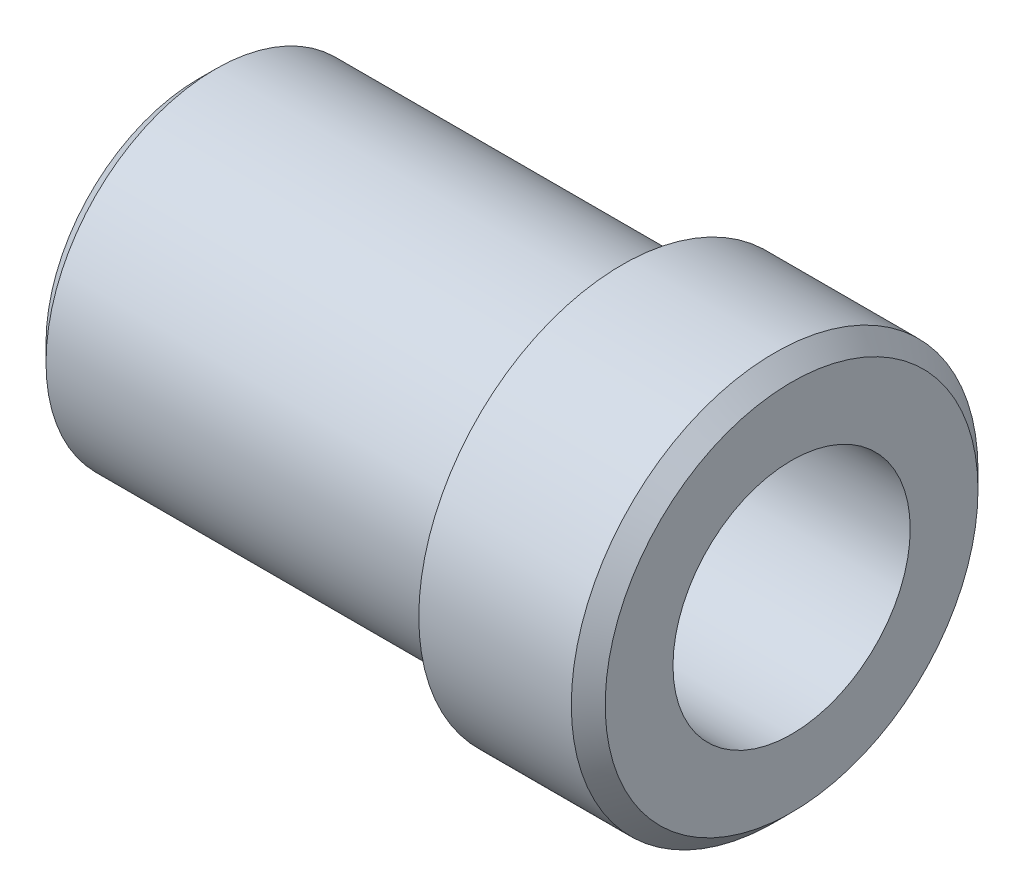
ISO-10303-21;
HEADER;
FILE_DESCRIPTION(('STEP AP214'),'2;1');
FILE_NAME('part.step','',(''),(''),'','','');
FILE_SCHEMA(('AUTOMOTIVE_DESIGN { 1 0 10303 214 1 1 1 1 }'));
ENDSEC;
DATA;
#1=APPLICATION_CONTEXT('core data for automotive mechanical design processes');
#2=APPLICATION_PROTOCOL_DEFINITION('international standard','automotive_design',2000,#1);
#3=PRODUCT_CONTEXT('',#1,'mechanical');
#4=PRODUCT('Part','Part','',(#3));
#5=PRODUCT_RELATED_PRODUCT_CATEGORY('part','',(#4));
#6=PRODUCT_DEFINITION_FORMATION('','',#4);
#7=PRODUCT_DEFINITION_CONTEXT('part definition',#1,'design');
#8=PRODUCT_DEFINITION('design','',#6,#7);
#9=PRODUCT_DEFINITION_SHAPE('','',#8);
#10=(LENGTH_UNIT() NAMED_UNIT(*) SI_UNIT(.MILLI.,.METRE.));
#11=(NAMED_UNIT(*) PLANE_ANGLE_UNIT() SI_UNIT($,.RADIAN.));
#12=(NAMED_UNIT(*) SI_UNIT($,.STERADIAN.) SOLID_ANGLE_UNIT());
#13=UNCERTAINTY_MEASURE_WITH_UNIT(LENGTH_MEASURE(1.E-05),#10,'distance_accuracy_value','');
#14=(GEOMETRIC_REPRESENTATION_CONTEXT(3) GLOBAL_UNCERTAINTY_ASSIGNED_CONTEXT((#13)) GLOBAL_UNIT_ASSIGNED_CONTEXT((#10,
#11,#12)) REPRESENTATION_CONTEXT('',''));
#15=CARTESIAN_POINT('',(0.,0.,0.));
#16=DIRECTION('',(0.,0.,1.));
#17=DIRECTION('',(1.,0.,0.));
#18=AXIS2_PLACEMENT_3D('',#15,#16,#17);
#19=CARTESIAN_POINT('',(0.,0.,0.));
#20=DIRECTION('',(1.,0.,0.));
#21=DIRECTION('',(0.,0.,-1.));
#22=AXIS2_PLACEMENT_3D('',#19,#20,#21);
#23=CYLINDRICAL_SURFACE('',#22,7.);
#24=CARTESIAN_POINT('',(0.,0.,0.));
#25=DIRECTION('',(1.,0.,0.));
#26=DIRECTION('',(0.,0.,-1.));
#27=AXIS2_PLACEMENT_3D('',#24,#25,#26);
#28=CIRCLE('',#27,7.);
#29=CARTESIAN_POINT('',(0.,0.,-7.));
#30=VERTEX_POINT('',#29);
#31=EDGE_CURVE('E64',#30,#30,#28,.T.);
#32=ORIENTED_EDGE('',*,*,#31,.T.);
#33=EDGE_LOOP('',(#32));
#34=FACE_BOUND('',#33,.T.);
#35=CARTESIAN_POINT('',(-35.,0.,0.));
#36=DIRECTION('',(1.,0.,0.));
#37=DIRECTION('',(0.,0.,-1.));
#38=AXIS2_PLACEMENT_3D('',#35,#36,#37);
#39=CIRCLE('',#38,7.);
#40=CARTESIAN_POINT('',(-35.,0.,-7.));
#41=VERTEX_POINT('',#40);
#42=EDGE_CURVE('E76',#41,#41,#39,.T.);
#43=ORIENTED_EDGE('',*,*,#42,.F.);
#44=EDGE_LOOP('',(#43));
#45=FACE_BOUND('',#44,.T.);
#46=ADVANCED_FACE('F39',(#34,#45),#23,.F.);
#47=CARTESIAN_POINT('',(0.,7.,0.));
#48=DIRECTION('',(1.,0.,0.));
#49=DIRECTION('',(0.,0.,-1.));
#50=AXIS2_PLACEMENT_3D('',#47,#48,#49);
#51=PLANE('',#50);
#52=CARTESIAN_POINT('',(0.,0.,0.));
#53=DIRECTION('',(1.,0.,0.));
#54=DIRECTION('',(0.,0.,-1.));
#55=AXIS2_PLACEMENT_3D('',#52,#53,#54);
#56=CIRCLE('',#55,11.);
#57=CARTESIAN_POINT('',(0.,0.,-11.));
#58=VERTEX_POINT('',#57);
#59=EDGE_CURVE('E58',#58,#58,#56,.T.);
#60=ORIENTED_EDGE('',*,*,#59,.T.);
#61=EDGE_LOOP('',(#60));
#62=FACE_BOUND('',#61,.T.);
#63=ORIENTED_EDGE('',*,*,#31,.F.);
#64=EDGE_LOOP('',(#63));
#65=FACE_BOUND('',#64,.T.);
#66=ADVANCED_FACE('F84',(#62,#65),#51,.T.);
#67=CARTESIAN_POINT('',(0.,0.,0.));
#68=DIRECTION('',(1.,0.,0.));
#69=DIRECTION('',(0.,0.,-1.));
#70=AXIS2_PLACEMENT_3D('',#67,#68,#69);
#71=CYLINDRICAL_SURFACE('',#70,12.);
#72=CARTESIAN_POINT('',(-0.999999999999999,0.,0.));
#73=DIRECTION('',(1.,0.,0.));
#74=DIRECTION('',(0.,0.,-1.));
#75=AXIS2_PLACEMENT_3D('',#72,#73,#74);
#76=CIRCLE('',#75,12.);
#77=CARTESIAN_POINT('',(-0.999999999999999,0.,-12.));
#78=VERTEX_POINT('',#77);
#79=EDGE_CURVE('E53',#78,#78,#76,.F.);
#80=ORIENTED_EDGE('',*,*,#79,.T.);
#81=EDGE_LOOP('',(#80));
#82=FACE_BOUND('',#81,.T.);
#83=CARTESIAN_POINT('',(-10.,0.,0.));
#84=DIRECTION('',(1.,0.,0.));
#85=DIRECTION('',(0.,0.,-1.));
#86=AXIS2_PLACEMENT_3D('',#83,#84,#85);
#87=CIRCLE('',#86,12.);
#88=CARTESIAN_POINT('',(-10.,0.,-12.));
#89=VERTEX_POINT('',#88);
#90=EDGE_CURVE('E68',#89,#89,#87,.T.);
#91=ORIENTED_EDGE('',*,*,#90,.T.);
#92=EDGE_LOOP('',(#91));
#93=FACE_BOUND('',#92,.T.);
#94=ADVANCED_FACE('F90',(#82,#93),#71,.T.);
#95=CARTESIAN_POINT('',(-10.,12.,0.));
#96=DIRECTION('',(-1.,0.,0.));
#97=DIRECTION('',(0.,0.,1.));
#98=AXIS2_PLACEMENT_3D('',#95,#96,#97);
#99=PLANE('',#98);
#100=CARTESIAN_POINT('',(-10.,0.,0.));
#101=DIRECTION('',(1.,0.,0.));
#102=DIRECTION('',(0.,0.,-1.));
#103=AXIS2_PLACEMENT_3D('',#100,#101,#102);
#104=CIRCLE('',#103,10.);
#105=CARTESIAN_POINT('',(-10.,0.,-10.));
#106=VERTEX_POINT('',#105);
#107=EDGE_CURVE('E72',#106,#106,#104,.T.);
#108=ORIENTED_EDGE('',*,*,#107,.T.);
#109=EDGE_LOOP('',(#108));
#110=FACE_BOUND('',#109,.T.);
#111=ORIENTED_EDGE('',*,*,#90,.F.);
#112=EDGE_LOOP('',(#111));
#113=FACE_BOUND('',#112,.T.);
#114=ADVANCED_FACE('F115',(#110,#113),#99,.T.);
#115=CARTESIAN_POINT('',(0.,0.,0.));
#116=DIRECTION('',(1.,0.,0.));
#117=DIRECTION('',(0.,0.,-1.));
#118=AXIS2_PLACEMENT_3D('',#115,#116,#117);
#119=CYLINDRICAL_SURFACE('',#118,10.);
#120=CARTESIAN_POINT('',(-34.,0.,0.));
#121=DIRECTION('',(-1.,0.,0.));
#122=DIRECTION('',(0.,0.,1.));
#123=AXIS2_PLACEMENT_3D('',#120,#121,#122);
#124=CIRCLE('',#123,10.);
#125=CARTESIAN_POINT('',(-34.,0.,10.));
#126=VERTEX_POINT('',#125);
#127=EDGE_CURVE('E48',#126,#126,#124,.F.);
#128=ORIENTED_EDGE('',*,*,#127,.T.);
#129=EDGE_LOOP('',(#128));
#130=FACE_BOUND('',#129,.T.);
#131=ORIENTED_EDGE('',*,*,#107,.F.);
#132=EDGE_LOOP('',(#131));
#133=FACE_BOUND('',#132,.T.);
#134=ADVANCED_FACE('F105',(#130,#133),#119,.T.);
#135=CARTESIAN_POINT('',(-35.,10.,0.));
#136=DIRECTION('',(-1.,0.,0.));
#137=DIRECTION('',(0.,0.,1.));
#138=AXIS2_PLACEMENT_3D('',#135,#136,#137);
#139=PLANE('',#138);
#140=CARTESIAN_POINT('',(-35.,0.,0.));
#141=DIRECTION('',(-1.,0.,0.));
#142=DIRECTION('',(0.,0.,1.));
#143=AXIS2_PLACEMENT_3D('',#140,#141,#142);
#144=CIRCLE('',#143,8.99999999999999);
#145=CARTESIAN_POINT('',(-35.,0.,8.99999999999999));
#146=VERTEX_POINT('',#145);
#147=EDGE_CURVE('E10',#146,#146,#144,.T.);
#148=ORIENTED_EDGE('',*,*,#147,.T.);
#149=EDGE_LOOP('',(#148));
#150=FACE_BOUND('',#149,.T.);
#151=ORIENTED_EDGE('',*,*,#42,.T.);
#152=EDGE_LOOP('',(#151));
#153=FACE_BOUND('',#152,.T.);
#154=ADVANCED_FACE('F81',(#150,#153),#139,.T.);
#155=CARTESIAN_POINT('',(0.,0.,0.));
#156=DIRECTION('',(-1.,0.,0.));
#157=DIRECTION('',(0.,0.,1.));
#158=AXIS2_PLACEMENT_3D('',#155,#156,#157);
#159=CONICAL_SURFACE('',#158,11.,0.785398163397445);
#160=ORIENTED_EDGE('',*,*,#79,.F.);
#161=EDGE_LOOP('',(#160));
#162=FACE_BOUND('',#161,.T.);
#163=ORIENTED_EDGE('',*,*,#59,.F.);
#164=EDGE_LOOP('',(#163));
#165=FACE_BOUND('',#164,.T.);
#166=ADVANCED_FACE('F95',(#162,#165),#159,.T.);
#167=CARTESIAN_POINT('',(-34.,0.,0.));
#168=DIRECTION('',(1.,0.,0.));
#169=DIRECTION('',(0.,0.,-1.));
#170=AXIS2_PLACEMENT_3D('',#167,#168,#169);
#171=CONICAL_SURFACE('',#170,10.,0.785398163397454);
#172=ORIENTED_EDGE('',*,*,#147,.F.);
#173=EDGE_LOOP('',(#172));
#174=FACE_BOUND('',#173,.T.);
#175=ORIENTED_EDGE('',*,*,#127,.F.);
#176=EDGE_LOOP('',(#175));
#177=FACE_BOUND('',#176,.T.);
#178=ADVANCED_FACE('F42',(#174,#177),#171,.T.);
#179=CLOSED_SHELL('',(#46,#66,#94,#114,#134,#154,#166,#178));
#180=MANIFOLD_SOLID_BREP('B2',#179);
#181=ADVANCED_BREP_SHAPE_REPRESENTATION('',(#18,#180),#14);
#182=SHAPE_DEFINITION_REPRESENTATION(#9,#181);
ENDSEC;
END-ISO-10303-21;
